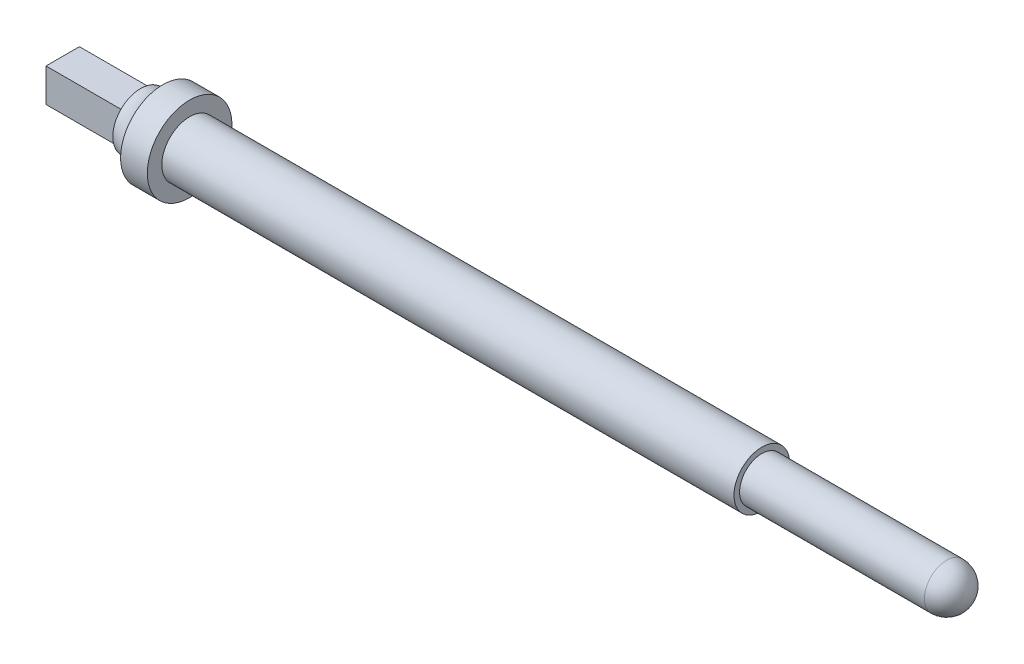
ISO-10303-21;
HEADER;
FILE_DESCRIPTION(('STEP AP214'),'2;1');
FILE_NAME('part.step','',(''),(''),'','','');
FILE_SCHEMA(('AUTOMOTIVE_DESIGN { 1 0 10303 214 1 1 1 1 }'));
ENDSEC;
DATA;
#1=APPLICATION_CONTEXT('core data for automotive mechanical design processes');
#2=APPLICATION_PROTOCOL_DEFINITION('international standard','automotive_design',2000,#1);
#3=PRODUCT_CONTEXT('',#1,'mechanical');
#4=PRODUCT('Part','Part','',(#3));
#5=PRODUCT_RELATED_PRODUCT_CATEGORY('part','',(#4));
#6=PRODUCT_DEFINITION_FORMATION('','',#4);
#7=PRODUCT_DEFINITION_CONTEXT('part definition',#1,'design');
#8=PRODUCT_DEFINITION('design','',#6,#7);
#9=PRODUCT_DEFINITION_SHAPE('','',#8);
#10=(LENGTH_UNIT() NAMED_UNIT(*) SI_UNIT(.MILLI.,.METRE.));
#11=(NAMED_UNIT(*) PLANE_ANGLE_UNIT() SI_UNIT($,.RADIAN.));
#12=(NAMED_UNIT(*) SI_UNIT($,.STERADIAN.) SOLID_ANGLE_UNIT());
#13=UNCERTAINTY_MEASURE_WITH_UNIT(LENGTH_MEASURE(1.E-05),#10,'distance_accuracy_value','');
#14=(GEOMETRIC_REPRESENTATION_CONTEXT(3) GLOBAL_UNCERTAINTY_ASSIGNED_CONTEXT((#13)) GLOBAL_UNIT_ASSIGNED_CONTEXT((#10,
#11,#12)) REPRESENTATION_CONTEXT('',''));
#15=CARTESIAN_POINT('',(0.,0.,0.));
#16=DIRECTION('',(0.,0.,1.));
#17=DIRECTION('',(1.,0.,0.));
#18=AXIS2_PLACEMENT_3D('',#15,#16,#17);
#19=CARTESIAN_POINT('',(-10.,12.5,0.));
#20=DIRECTION('',(1.,0.,0.));
#21=DIRECTION('',(0.,1.,0.));
#22=AXIS2_PLACEMENT_3D('',#19,#20,#21);
#23=PLANE('',#22);
#24=CARTESIAN_POINT('',(-10.,0.,0.));
#25=DIRECTION('',(-1.,0.,0.));
#26=DIRECTION('',(0.,-1.,0.));
#27=AXIS2_PLACEMENT_3D('',#24,#25,#26);
#28=CIRCLE('',#27,12.5);
#29=CARTESIAN_POINT('',(-10.,-12.5,0.));
#30=VERTEX_POINT('',#29);
#31=EDGE_CURVE('E11',#30,#30,#28,.T.);
#32=ORIENTED_EDGE('',*,*,#31,.T.);
#33=EDGE_LOOP('',(#32));
#34=FACE_BOUND('',#33,.T.);
#35=DIRECTION('',(0.,-1.,0.));
#36=VECTOR('',#35,1.);
#37=CARTESIAN_POINT('',(-10.,-7.5,-7.5));
#38=LINE('',#37,#36);
#39=CARTESIAN_POINT('',(-10.,7.5,-7.5));
#40=VERTEX_POINT('',#39);
#41=CARTESIAN_POINT('',(-10.,-7.5,-7.5));
#42=VERTEX_POINT('',#41);
#43=EDGE_CURVE('E48',#40,#42,#38,.T.);
#44=ORIENTED_EDGE('',*,*,#43,.F.);
#45=DIRECTION('',(0.,0.,-1.));
#46=VECTOR('',#45,1.);
#47=CARTESIAN_POINT('',(-10.,7.5,7.5));
#48=LINE('',#47,#46);
#49=CARTESIAN_POINT('',(-10.,7.5,7.5));
#50=VERTEX_POINT('',#49);
#51=EDGE_CURVE('E52',#50,#40,#48,.T.);
#52=ORIENTED_EDGE('',*,*,#51,.F.);
#53=DIRECTION('',(0.,1.,0.));
#54=VECTOR('',#53,1.);
#55=CARTESIAN_POINT('',(-10.,-7.5,7.5));
#56=LINE('',#55,#54);
#57=CARTESIAN_POINT('',(-10.,-7.5,7.5));
#58=VERTEX_POINT('',#57);
#59=EDGE_CURVE('E241',#58,#50,#56,.T.);
#60=ORIENTED_EDGE('',*,*,#59,.F.);
#61=DIRECTION('',(0.,0.,1.));
#62=VECTOR('',#61,1.);
#63=CARTESIAN_POINT('',(-10.,-7.5,7.5));
#64=LINE('',#63,#62);
#65=EDGE_CURVE('E247',#42,#58,#64,.T.);
#66=ORIENTED_EDGE('',*,*,#65,.F.);
#67=EDGE_LOOP('',(#44,#52,#60,#66));
#68=FACE_BOUND('',#67,.T.);
#69=ADVANCED_FACE('F33',(#34,#68),#23,.F.);
#70=CARTESIAN_POINT('',(-10.7388886382261,0.,0.));
#71=DIRECTION('',(-1.,0.,0.));
#72=DIRECTION('',(0.,-1.,0.));
#73=AXIS2_PLACEMENT_3D('',#70,#71,#72);
#74=TOROIDAL_SURFACE('',#73,24.5790594434248,12.101637635357);
#75=CARTESIAN_POINT('',(0.,0.,0.));
#76=DIRECTION('',(-1.,0.,0.));
#77=DIRECTION('',(0.,-1.,0.));
#78=AXIS2_PLACEMENT_3D('',#75,#76,#77);
#79=CIRCLE('',#78,19.);
#80=CARTESIAN_POINT('',(0.,-19.,0.));
#81=VERTEX_POINT('',#80);
#82=EDGE_CURVE('E94',#81,#81,#79,.T.);
#83=ORIENTED_EDGE('',*,*,#82,.T.);
#84=EDGE_LOOP('',(#83));
#85=FACE_BOUND('',#84,.T.);
#86=ORIENTED_EDGE('',*,*,#31,.F.);
#87=EDGE_LOOP('',(#86));
#88=FACE_BOUND('',#87,.T.);
#89=ADVANCED_FACE('F35',(#85,#88),#74,.F.);
#90=CARTESIAN_POINT('',(352.,0.,0.));
#91=DIRECTION('',(-1.,0.,0.));
#92=DIRECTION('',(0.,-1.,0.));
#93=AXIS2_PLACEMENT_3D('',#90,#91,#92);
#94=SPHERICAL_SURFACE('',#93,9.99999999999998);
#95=CARTESIAN_POINT('',(352.,0.,0.));
#96=DIRECTION('',(-1.,0.,0.));
#97=DIRECTION('',(0.,-1.,0.));
#98=AXIS2_PLACEMENT_3D('',#95,#96,#97);
#99=CIRCLE('',#98,10.);
#100=CARTESIAN_POINT('',(352.,-10.,0.));
#101=VERTEX_POINT('',#100);
#102=EDGE_CURVE('E41',#101,#101,#99,.T.);
#103=ORIENTED_EDGE('',*,*,#102,.F.);
#104=EDGE_LOOP('',(#103));
#105=FACE_BOUND('',#104,.T.);
#106=ADVANCED_FACE('F119',(#105),#94,.T.);
#107=CARTESIAN_POINT('',(-14.3328136356439,0.,0.));
#108=DIRECTION('',(-1.,0.,0.));
#109=DIRECTION('',(0.,-1.,0.));
#110=AXIS2_PLACEMENT_3D('',#107,#108,#109);
#111=CYLINDRICAL_SURFACE('',#110,9.99999999999999);
#112=ORIENTED_EDGE('',*,*,#102,.T.);
#113=EDGE_LOOP('',(#112));
#114=FACE_BOUND('',#113,.T.);
#115=CARTESIAN_POINT('',(269.,0.,0.));
#116=DIRECTION('',(-1.,0.,0.));
#117=DIRECTION('',(0.,-1.,0.));
#118=AXIS2_PLACEMENT_3D('',#115,#116,#117);
#119=CIRCLE('',#118,9.99999999999998);
#120=CARTESIAN_POINT('',(269.,-9.99999999999998,0.));
#121=VERTEX_POINT('',#120);
#122=EDGE_CURVE('E111',#121,#121,#119,.T.);
#123=ORIENTED_EDGE('',*,*,#122,.F.);
#124=EDGE_LOOP('',(#123));
#125=FACE_BOUND('',#124,.T.);
#126=ADVANCED_FACE('F116',(#114,#125),#111,.T.);
#127=CARTESIAN_POINT('',(269.,12.5,0.));
#128=DIRECTION('',(1.,0.,0.));
#129=DIRECTION('',(0.,1.,0.));
#130=AXIS2_PLACEMENT_3D('',#127,#128,#129);
#131=PLANE('',#130);
#132=ORIENTED_EDGE('',*,*,#122,.T.);
#133=EDGE_LOOP('',(#132));
#134=FACE_BOUND('',#133,.T.);
#135=CARTESIAN_POINT('',(269.,0.,0.));
#136=DIRECTION('',(-1.,0.,0.));
#137=DIRECTION('',(0.,-1.,0.));
#138=AXIS2_PLACEMENT_3D('',#135,#136,#137);
#139=CIRCLE('',#138,12.5);
#140=CARTESIAN_POINT('',(269.,-12.5,0.));
#141=VERTEX_POINT('',#140);
#142=EDGE_CURVE('E108',#141,#141,#139,.T.);
#143=ORIENTED_EDGE('',*,*,#142,.F.);
#144=EDGE_LOOP('',(#143));
#145=FACE_BOUND('',#144,.T.);
#146=ADVANCED_FACE('F126',(#134,#145),#131,.T.);
#147=CARTESIAN_POINT('',(-14.3328136356439,0.,0.));
#148=DIRECTION('',(-1.,0.,0.));
#149=DIRECTION('',(0.,-1.,0.));
#150=AXIS2_PLACEMENT_3D('',#147,#148,#149);
#151=CYLINDRICAL_SURFACE('',#150,12.5);
#152=ORIENTED_EDGE('',*,*,#142,.T.);
#153=EDGE_LOOP('',(#152));
#154=FACE_BOUND('',#153,.T.);
#155=CARTESIAN_POINT('',(12.,0.,0.));
#156=DIRECTION('',(-1.,0.,0.));
#157=DIRECTION('',(0.,-1.,0.));
#158=AXIS2_PLACEMENT_3D('',#155,#156,#157);
#159=CIRCLE('',#158,12.5);
#160=CARTESIAN_POINT('',(12.,-12.5,0.));
#161=VERTEX_POINT('',#160);
#162=EDGE_CURVE('E105',#161,#161,#159,.T.);
#163=ORIENTED_EDGE('',*,*,#162,.F.);
#164=EDGE_LOOP('',(#163));
#165=FACE_BOUND('',#164,.T.);
#166=ADVANCED_FACE('F160',(#154,#165),#151,.T.);
#167=CARTESIAN_POINT('',(12.,19.,0.));
#168=DIRECTION('',(1.,0.,0.));
#169=DIRECTION('',(0.,1.,0.));
#170=AXIS2_PLACEMENT_3D('',#167,#168,#169);
#171=PLANE('',#170);
#172=ORIENTED_EDGE('',*,*,#162,.T.);
#173=EDGE_LOOP('',(#172));
#174=FACE_BOUND('',#173,.T.);
#175=CARTESIAN_POINT('',(12.,0.,0.));
#176=DIRECTION('',(-1.,0.,0.));
#177=DIRECTION('',(0.,-1.,0.));
#178=AXIS2_PLACEMENT_3D('',#175,#176,#177);
#179=CIRCLE('',#178,19.);
#180=CARTESIAN_POINT('',(12.,-19.,0.));
#181=VERTEX_POINT('',#180);
#182=EDGE_CURVE('E97',#181,#181,#179,.T.);
#183=ORIENTED_EDGE('',*,*,#182,.F.);
#184=EDGE_LOOP('',(#183));
#185=FACE_BOUND('',#184,.T.);
#186=ADVANCED_FACE('F170',(#174,#185),#171,.T.);
#187=CARTESIAN_POINT('',(-14.3328136356439,0.,0.));
#188=DIRECTION('',(-1.,0.,0.));
#189=DIRECTION('',(0.,-1.,0.));
#190=AXIS2_PLACEMENT_3D('',#187,#188,#189);
#191=CYLINDRICAL_SURFACE('',#190,19.);
#192=ORIENTED_EDGE('',*,*,#182,.T.);
#193=EDGE_LOOP('',(#192));
#194=FACE_BOUND('',#193,.T.);
#195=ORIENTED_EDGE('',*,*,#82,.F.);
#196=EDGE_LOOP('',(#195));
#197=FACE_BOUND('',#196,.T.);
#198=ADVANCED_FACE('F179',(#194,#197),#191,.T.);
#199=CARTESIAN_POINT('',(-45.,-7.5,-7.5));
#200=DIRECTION('',(0.,0.,1.));
#201=DIRECTION('',(1.,0.,0.));
#202=AXIS2_PLACEMENT_3D('',#199,#200,#201);
#203=PLANE('',#202);
#204=ORIENTED_EDGE('',*,*,#43,.T.);
#205=DIRECTION('',(1.,0.,0.));
#206=VECTOR('',#205,1.);
#207=CARTESIAN_POINT('',(-45.,-7.5,-7.5));
#208=LINE('',#207,#206);
#209=CARTESIAN_POINT('',(-45.,-7.5,-7.5));
#210=VERTEX_POINT('',#209);
#211=EDGE_CURVE('E77',#210,#42,#208,.T.);
#212=ORIENTED_EDGE('',*,*,#211,.F.);
#213=DIRECTION('',(0.,-1.,0.));
#214=VECTOR('',#213,1.);
#215=CARTESIAN_POINT('',(-45.,-7.5,-7.5));
#216=LINE('',#215,#214);
#217=CARTESIAN_POINT('',(-45.,7.5,-7.5));
#218=VERTEX_POINT('',#217);
#219=EDGE_CURVE('E83',#218,#210,#216,.T.);
#220=ORIENTED_EDGE('',*,*,#219,.F.);
#221=DIRECTION('',(1.,0.,0.));
#222=VECTOR('',#221,1.);
#223=CARTESIAN_POINT('',(-45.,7.5,-7.5));
#224=LINE('',#223,#222);
#225=EDGE_CURVE('E239',#218,#40,#224,.T.);
#226=ORIENTED_EDGE('',*,*,#225,.T.);
#227=EDGE_LOOP('',(#204,#212,#220,#226));
#228=FACE_BOUND('',#227,.T.);
#229=ADVANCED_FACE('F93',(#228),#203,.F.);
#230=CARTESIAN_POINT('',(-45.,-7.5,7.5));
#231=DIRECTION('',(0.,1.,0.));
#232=DIRECTION('',(0.,0.,1.));
#233=AXIS2_PLACEMENT_3D('',#230,#231,#232);
#234=PLANE('',#233);
#235=ORIENTED_EDGE('',*,*,#65,.T.);
#236=DIRECTION('',(1.,0.,0.));
#237=VECTOR('',#236,1.);
#238=CARTESIAN_POINT('',(-45.,-7.5,7.5));
#239=LINE('',#238,#237);
#240=CARTESIAN_POINT('',(-45.,-7.5,7.5));
#241=VERTEX_POINT('',#240);
#242=EDGE_CURVE('E79',#241,#58,#239,.T.);
#243=ORIENTED_EDGE('',*,*,#242,.F.);
#244=DIRECTION('',(0.,0.,1.));
#245=VECTOR('',#244,1.);
#246=CARTESIAN_POINT('',(-45.,-7.5,7.5));
#247=LINE('',#246,#245);
#248=EDGE_CURVE('E72',#210,#241,#247,.T.);
#249=ORIENTED_EDGE('',*,*,#248,.F.);
#250=ORIENTED_EDGE('',*,*,#211,.T.);
#251=EDGE_LOOP('',(#235,#243,#249,#250));
#252=FACE_BOUND('',#251,.T.);
#253=ADVANCED_FACE('F75',(#252),#234,.F.);
#254=CARTESIAN_POINT('',(-45.,-7.5,7.5));
#255=DIRECTION('',(0.,0.,-1.));
#256=DIRECTION('',(-1.,0.,0.));
#257=AXIS2_PLACEMENT_3D('',#254,#255,#256);
#258=PLANE('',#257);
#259=ORIENTED_EDGE('',*,*,#59,.T.);
#260=DIRECTION('',(1.,0.,0.));
#261=VECTOR('',#260,1.);
#262=CARTESIAN_POINT('',(-45.,7.5,7.5));
#263=LINE('',#262,#261);
#264=CARTESIAN_POINT('',(-45.,7.5,7.5));
#265=VERTEX_POINT('',#264);
#266=EDGE_CURVE('E99',#265,#50,#263,.T.);
#267=ORIENTED_EDGE('',*,*,#266,.F.);
#268=DIRECTION('',(0.,1.,0.));
#269=VECTOR('',#268,1.);
#270=CARTESIAN_POINT('',(-45.,-7.5,7.5));
#271=LINE('',#270,#269);
#272=EDGE_CURVE('E82',#241,#265,#271,.T.);
#273=ORIENTED_EDGE('',*,*,#272,.F.);
#274=ORIENTED_EDGE('',*,*,#242,.T.);
#275=EDGE_LOOP('',(#259,#267,#273,#274));
#276=FACE_BOUND('',#275,.T.);
#277=ADVANCED_FACE('F202',(#276),#258,.F.);
#278=CARTESIAN_POINT('',(-45.,7.5,7.5));
#279=DIRECTION('',(0.,-1.,0.));
#280=DIRECTION('',(0.,0.,-1.));
#281=AXIS2_PLACEMENT_3D('',#278,#279,#280);
#282=PLANE('',#281);
#283=ORIENTED_EDGE('',*,*,#51,.T.);
#284=ORIENTED_EDGE('',*,*,#225,.F.);
#285=DIRECTION('',(0.,0.,-1.));
#286=VECTOR('',#285,1.);
#287=CARTESIAN_POINT('',(-45.,7.5,7.5));
#288=LINE('',#287,#286);
#289=EDGE_CURVE('E88',#265,#218,#288,.T.);
#290=ORIENTED_EDGE('',*,*,#289,.F.);
#291=ORIENTED_EDGE('',*,*,#266,.T.);
#292=EDGE_LOOP('',(#283,#284,#290,#291));
#293=FACE_BOUND('',#292,.T.);
#294=ADVANCED_FACE('F209',(#293),#282,.F.);
#295=CARTESIAN_POINT('',(-45.,0.,0.));
#296=DIRECTION('',(-1.,0.,0.));
#297=DIRECTION('',(0.,0.,1.));
#298=AXIS2_PLACEMENT_3D('',#295,#296,#297);
#299=PLANE('',#298);
#300=ORIENTED_EDGE('',*,*,#219,.T.);
#301=ORIENTED_EDGE('',*,*,#248,.T.);
#302=ORIENTED_EDGE('',*,*,#272,.T.);
#303=ORIENTED_EDGE('',*,*,#289,.T.);
#304=EDGE_LOOP('',(#300,#301,#302,#303));
#305=FACE_BOUND('',#304,.T.);
#306=ADVANCED_FACE('F86',(#305),#299,.T.);
#307=CLOSED_SHELL('',(#69,#89,#106,#126,#146,#166,#186,#198,#229,#253,#277,#294,#306));
#308=MANIFOLD_SOLID_BREP('B2',#307);
#309=ADVANCED_BREP_SHAPE_REPRESENTATION('',(#18,#308),#14);
#310=SHAPE_DEFINITION_REPRESENTATION(#9,#309);
ENDSEC;
END-ISO-10303-21;
